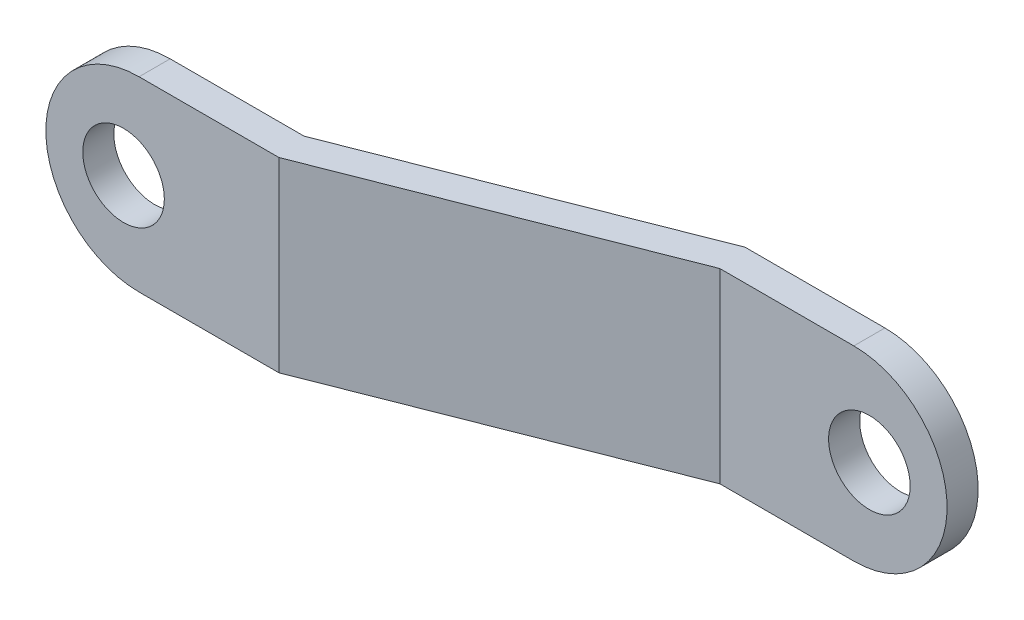
ISO-10303-21;
HEADER;
FILE_DESCRIPTION(('STEP AP214'),'2;1');
FILE_NAME('part.step','',(''),(''),'','','');
FILE_SCHEMA(('AUTOMOTIVE_DESIGN { 1 0 10303 214 1 1 1 1 }'));
ENDSEC;
DATA;
#1=APPLICATION_CONTEXT('core data for automotive mechanical design processes');
#2=APPLICATION_PROTOCOL_DEFINITION('international standard','automotive_design',2000,#1);
#3=PRODUCT_CONTEXT('',#1,'mechanical');
#4=PRODUCT('Part','Part','',(#3));
#5=PRODUCT_RELATED_PRODUCT_CATEGORY('part','',(#4));
#6=PRODUCT_DEFINITION_FORMATION('','',#4);
#7=PRODUCT_DEFINITION_CONTEXT('part definition',#1,'design');
#8=PRODUCT_DEFINITION('design','',#6,#7);
#9=PRODUCT_DEFINITION_SHAPE('','',#8);
#10=(LENGTH_UNIT() NAMED_UNIT(*) SI_UNIT(.MILLI.,.METRE.));
#11=(NAMED_UNIT(*) PLANE_ANGLE_UNIT() SI_UNIT($,.RADIAN.));
#12=(NAMED_UNIT(*) SI_UNIT($,.STERADIAN.) SOLID_ANGLE_UNIT());
#13=UNCERTAINTY_MEASURE_WITH_UNIT(LENGTH_MEASURE(1.E-05),#10,'distance_accuracy_value','');
#14=(GEOMETRIC_REPRESENTATION_CONTEXT(3) GLOBAL_UNCERTAINTY_ASSIGNED_CONTEXT((#13)) GLOBAL_UNIT_ASSIGNED_CONTEXT((#10,
#11,#12)) REPRESENTATION_CONTEXT('',''));
#15=CARTESIAN_POINT('',(0.,0.,0.));
#16=DIRECTION('',(0.,0.,1.));
#17=DIRECTION('',(1.,0.,0.));
#18=AXIS2_PLACEMENT_3D('',#15,#16,#17);
#19=CARTESIAN_POINT('',(-77.9706929487342,4.8,-7.76408510071878));
#20=DIRECTION('',(0.,0.,-1.));
#21=DIRECTION('',(-1.,0.,0.));
#22=AXIS2_PLACEMENT_3D('',#19,#20,#21);
#23=CYLINDRICAL_SURFACE('',#22,4.8);
#24=CARTESIAN_POINT('',(-77.9706929487342,4.8,-9.36408510071879));
#25=DIRECTION('',(0.,0.,-1.));
#26=DIRECTION('',(-1.,0.,0.));
#27=AXIS2_PLACEMENT_3D('',#24,#25,#26);
#28=CIRCLE('',#27,4.8);
#29=CARTESIAN_POINT('',(-77.9706929487342,9.6,-9.36408510071879));
#30=VERTEX_POINT('',#29);
#31=CARTESIAN_POINT('',(-77.9706929487342,0.,-9.36408510071879));
#32=VERTEX_POINT('',#31);
#33=EDGE_CURVE('E20',#30,#32,#28,.F.);
#34=ORIENTED_EDGE('',*,*,#33,.T.);
#35=DIRECTION('',(0.,0.,1.));
#36=VECTOR('',#35,1.);
#37=CARTESIAN_POINT('',(-77.9706929487342,0.,-7.76408510071878));
#38=LINE('',#37,#36);
#39=CARTESIAN_POINT('',(-77.9706929487342,0.,-7.76408510071878));
#40=VERTEX_POINT('',#39);
#41=EDGE_CURVE('E123',#32,#40,#38,.T.);
#42=ORIENTED_EDGE('',*,*,#41,.T.);
#43=CARTESIAN_POINT('',(-77.9706929487342,4.8,-7.76408510071878));
#44=DIRECTION('',(0.,0.,-1.));
#45=DIRECTION('',(-1.,0.,0.));
#46=AXIS2_PLACEMENT_3D('',#43,#44,#45);
#47=CIRCLE('',#46,4.8);
#48=CARTESIAN_POINT('',(-77.9706929487342,9.6,-7.76408510071878));
#49=VERTEX_POINT('',#48);
#50=EDGE_CURVE('E83',#40,#49,#47,.T.);
#51=ORIENTED_EDGE('',*,*,#50,.T.);
#52=DIRECTION('',(0.,0.,-1.));
#53=VECTOR('',#52,1.);
#54=CARTESIAN_POINT('',(-77.9706929487342,9.6,-7.76408510071878));
#55=LINE('',#54,#53);
#56=EDGE_CURVE('E79',#49,#30,#55,.T.);
#57=ORIENTED_EDGE('',*,*,#56,.T.);
#58=EDGE_LOOP('',(#34,#42,#51,#57));
#59=FACE_BOUND('',#58,.T.);
#60=ADVANCED_FACE('F17',(#59),#23,.T.);
#61=CARTESIAN_POINT('',(-78.7706929487342,4.8,-15.7640851007188));
#62=DIRECTION('',(0.,0.,1.));
#63=DIRECTION('',(1.,0.,0.));
#64=AXIS2_PLACEMENT_3D('',#61,#62,#63);
#65=CYLINDRICAL_SURFACE('',#64,2.1);
#66=CARTESIAN_POINT('',(-78.7706929487342,4.8,-9.36408510071879));
#67=DIRECTION('',(0.,0.,1.));
#68=DIRECTION('',(1.,0.,0.));
#69=AXIS2_PLACEMENT_3D('',#66,#67,#68);
#70=CIRCLE('',#69,2.1);
#71=CARTESIAN_POINT('',(-76.6706929487342,4.8,-9.36408510071879));
#72=VERTEX_POINT('',#71);
#73=EDGE_CURVE('E96',#72,#72,#70,.F.);
#74=ORIENTED_EDGE('',*,*,#73,.T.);
#75=EDGE_LOOP('',(#74));
#76=FACE_BOUND('',#75,.T.);
#77=CARTESIAN_POINT('',(-78.7706929487342,4.8,-7.76408510071878));
#78=DIRECTION('',(0.,0.,1.));
#79=DIRECTION('',(1.,0.,0.));
#80=AXIS2_PLACEMENT_3D('',#77,#78,#79);
#81=CIRCLE('',#80,2.1);
#82=CARTESIAN_POINT('',(-76.6706929487342,4.8,-7.76408510071878));
#83=VERTEX_POINT('',#82);
#84=EDGE_CURVE('E119',#83,#83,#81,.T.);
#85=ORIENTED_EDGE('',*,*,#84,.T.);
#86=EDGE_LOOP('',(#85));
#87=FACE_BOUND('',#86,.T.);
#88=ADVANCED_FACE('F150',(#76,#87),#65,.F.);
#89=CARTESIAN_POINT('',(-42.7706929487342,9.6,-15.7640851007188));
#90=DIRECTION('',(0.,0.,1.));
#91=DIRECTION('',(1.,0.,0.));
#92=AXIS2_PLACEMENT_3D('',#89,#90,#91);
#93=PLANE('',#92);
#94=CARTESIAN_POINT('',(-46.7706929487342,4.8,-15.7640851007188));
#95=DIRECTION('',(0.,0.,1.));
#96=DIRECTION('',(1.,0.,0.));
#97=AXIS2_PLACEMENT_3D('',#94,#95,#96);
#98=CIRCLE('',#97,2.1);
#99=CARTESIAN_POINT('',(-44.6706929487342,4.8,-15.7640851007188));
#100=VERTEX_POINT('',#99);
#101=EDGE_CURVE('E130',#100,#100,#98,.T.);
#102=ORIENTED_EDGE('',*,*,#101,.T.);
#103=EDGE_LOOP('',(#102));
#104=FACE_BOUND('',#103,.T.);
#105=DIRECTION('',(1.,0.,0.));
#106=VECTOR('',#105,1.);
#107=CARTESIAN_POINT('',(-82.7706929487342,0.,-15.7640851007188));
#108=LINE('',#107,#106);
#109=CARTESIAN_POINT('',(-47.5706929487342,0.,-15.7640851007188));
#110=VERTEX_POINT('',#109);
#111=CARTESIAN_POINT('',(-54.7706929487342,0.,-15.7640851007188));
#112=VERTEX_POINT('',#111);
#113=EDGE_CURVE('E126',#110,#112,#108,.F.);
#114=ORIENTED_EDGE('',*,*,#113,.T.);
#115=DIRECTION('',(0.,1.,0.));
#116=VECTOR('',#115,1.);
#117=CARTESIAN_POINT('',(-54.7706929487342,9.6,-15.7640851007188));
#118=LINE('',#117,#116);
#119=CARTESIAN_POINT('',(-54.7706929487342,9.6,-15.7640851007188));
#120=VERTEX_POINT('',#119);
#121=EDGE_CURVE('E87',#112,#120,#118,.T.);
#122=ORIENTED_EDGE('',*,*,#121,.T.);
#123=DIRECTION('',(1.,0.,0.));
#124=VECTOR('',#123,1.);
#125=CARTESIAN_POINT('',(-82.7706929487342,9.6,-15.7640851007188));
#126=LINE('',#125,#124);
#127=CARTESIAN_POINT('',(-47.5706929487342,9.6,-15.7640851007188));
#128=VERTEX_POINT('',#127);
#129=EDGE_CURVE('E106',#128,#120,#126,.F.);
#130=ORIENTED_EDGE('',*,*,#129,.F.);
#131=CARTESIAN_POINT('',(-47.5706929487342,4.8,-15.7640851007188));
#132=DIRECTION('',(0.,0.,-1.));
#133=DIRECTION('',(-1.,0.,0.));
#134=AXIS2_PLACEMENT_3D('',#131,#132,#133);
#135=CIRCLE('',#134,4.8);
#136=EDGE_CURVE('E146',#110,#128,#135,.F.);
#137=ORIENTED_EDGE('',*,*,#136,.F.);
#138=EDGE_LOOP('',(#114,#122,#130,#137));
#139=FACE_BOUND('',#138,.T.);
#140=ADVANCED_FACE('F165',(#104,#139),#93,.F.);
#141=CARTESIAN_POINT('',(-54.7706929487342,9.6,-15.7640851007188));
#142=DIRECTION('',(0.365421149026402,0.,0.930842298052803));
#143=DIRECTION('',(0.930842298052803,0.,-0.365421149026402));
#144=AXIS2_PLACEMENT_3D('',#141,#142,#143);
#145=PLANE('',#144);
#146=DIRECTION('',(-0.930842298052803,0.,0.365421149026402));
#147=VECTOR('',#146,1.);
#148=CARTESIAN_POINT('',(-54.7706929487342,9.6,-15.7640851007188));
#149=LINE('',#148,#147);
#150=CARTESIAN_POINT('',(-71.0735006089102,9.6,-9.36408510071879));
#151=VERTEX_POINT('',#150);
#152=EDGE_CURVE('E100',#120,#151,#149,.T.);
#153=ORIENTED_EDGE('',*,*,#152,.F.);
#154=ORIENTED_EDGE('',*,*,#121,.F.);
#155=DIRECTION('',(-0.930842298052803,0.,0.365421149026403));
#156=VECTOR('',#155,1.);
#157=CARTESIAN_POINT('',(-54.7706929487342,0.,-15.7640851007188));
#158=LINE('',#157,#156);
#159=CARTESIAN_POINT('',(-71.0735006089102,0.,-9.36408510071878));
#160=VERTEX_POINT('',#159);
#161=EDGE_CURVE('E129',#112,#160,#158,.T.);
#162=ORIENTED_EDGE('',*,*,#161,.T.);
#163=DIRECTION('',(0.,1.,0.));
#164=VECTOR('',#163,1.);
#165=CARTESIAN_POINT('',(-71.0735006089102,9.6,-9.36408510071879));
#166=LINE('',#165,#164);
#167=EDGE_CURVE('E97',#160,#151,#166,.T.);
#168=ORIENTED_EDGE('',*,*,#167,.T.);
#169=EDGE_LOOP('',(#153,#154,#162,#168));
#170=FACE_BOUND('',#169,.T.);
#171=ADVANCED_FACE('F155',(#170),#145,.F.);
#172=CARTESIAN_POINT('',(-71.0735006089102,9.6,-9.36408510071879));
#173=DIRECTION('',(0.,0.,1.));
#174=DIRECTION('',(1.,0.,0.));
#175=AXIS2_PLACEMENT_3D('',#172,#173,#174);
#176=PLANE('',#175);
#177=ORIENTED_EDGE('',*,*,#73,.F.);
#178=EDGE_LOOP('',(#177));
#179=FACE_BOUND('',#178,.T.);
#180=DIRECTION('',(1.,0.,0.));
#181=VECTOR('',#180,1.);
#182=CARTESIAN_POINT('',(-82.7706929487342,9.6,-9.36408510071879));
#183=LINE('',#182,#181);
#184=EDGE_CURVE('E93',#151,#30,#183,.F.);
#185=ORIENTED_EDGE('',*,*,#184,.F.);
#186=ORIENTED_EDGE('',*,*,#167,.F.);
#187=DIRECTION('',(1.,0.,0.));
#188=VECTOR('',#187,1.);
#189=CARTESIAN_POINT('',(-82.7706929487342,0.,-9.36408510071879));
#190=LINE('',#189,#188);
#191=EDGE_CURVE('E95',#160,#32,#190,.F.);
#192=ORIENTED_EDGE('',*,*,#191,.T.);
#193=ORIENTED_EDGE('',*,*,#33,.F.);
#194=EDGE_LOOP('',(#185,#186,#192,#193));
#195=FACE_BOUND('',#194,.T.);
#196=ADVANCED_FACE('F92',(#179,#195),#176,.F.);
#197=CARTESIAN_POINT('',(-47.5706929487342,4.8,-14.1640851007188));
#198=DIRECTION('',(0.,0.,-1.));
#199=DIRECTION('',(-1.,0.,0.));
#200=AXIS2_PLACEMENT_3D('',#197,#198,#199);
#201=CYLINDRICAL_SURFACE('',#200,4.8);
#202=DIRECTION('',(0.,0.,1.));
#203=VECTOR('',#202,1.);
#204=CARTESIAN_POINT('',(-47.5706929487342,9.6,-7.76408510071878));
#205=LINE('',#204,#203);
#206=CARTESIAN_POINT('',(-47.5706929487342,9.6,-14.1640851007188));
#207=VERTEX_POINT('',#206);
#208=EDGE_CURVE('E116',#207,#128,#205,.F.);
#209=ORIENTED_EDGE('',*,*,#208,.F.);
#210=CARTESIAN_POINT('',(-47.5706929487342,4.8,-14.1640851007188));
#211=DIRECTION('',(0.,0.,-1.));
#212=DIRECTION('',(-1.,0.,0.));
#213=AXIS2_PLACEMENT_3D('',#210,#211,#212);
#214=CIRCLE('',#213,4.8);
#215=CARTESIAN_POINT('',(-47.5706929487342,0.,-14.1640851007188));
#216=VERTEX_POINT('',#215);
#217=EDGE_CURVE('E137',#207,#216,#214,.T.);
#218=ORIENTED_EDGE('',*,*,#217,.T.);
#219=DIRECTION('',(0.,0.,1.));
#220=VECTOR('',#219,1.);
#221=CARTESIAN_POINT('',(-47.5706929487342,0.,-7.76408510071878));
#222=LINE('',#221,#220);
#223=EDGE_CURVE('E124',#216,#110,#222,.F.);
#224=ORIENTED_EDGE('',*,*,#223,.T.);
#225=ORIENTED_EDGE('',*,*,#136,.T.);
#226=EDGE_LOOP('',(#209,#218,#224,#225));
#227=FACE_BOUND('',#226,.T.);
#228=ADVANCED_FACE('F154',(#227),#201,.T.);
#229=CARTESIAN_POINT('',(-46.7706929487342,4.8,-15.7640851007188));
#230=DIRECTION('',(0.,0.,1.));
#231=DIRECTION('',(1.,0.,0.));
#232=AXIS2_PLACEMENT_3D('',#229,#230,#231);
#233=CYLINDRICAL_SURFACE('',#232,2.1);
#234=ORIENTED_EDGE('',*,*,#101,.F.);
#235=EDGE_LOOP('',(#234));
#236=FACE_BOUND('',#235,.T.);
#237=CARTESIAN_POINT('',(-46.7706929487342,4.8,-14.1640851007188));
#238=DIRECTION('',(0.,0.,1.));
#239=DIRECTION('',(1.,0.,0.));
#240=AXIS2_PLACEMENT_3D('',#237,#238,#239);
#241=CIRCLE('',#240,2.1);
#242=CARTESIAN_POINT('',(-44.6706929487342,4.8,-14.1640851007188));
#243=VERTEX_POINT('',#242);
#244=EDGE_CURVE('E134',#243,#243,#241,.T.);
#245=ORIENTED_EDGE('',*,*,#244,.T.);
#246=EDGE_LOOP('',(#245));
#247=FACE_BOUND('',#246,.T.);
#248=ADVANCED_FACE('F162',(#236,#247),#233,.F.);
#249=CARTESIAN_POINT('',(-82.7706929487342,0.,-7.76408510071878));
#250=DIRECTION('',(0.,1.,0.));
#251=DIRECTION('',(0.,0.,1.));
#252=AXIS2_PLACEMENT_3D('',#249,#250,#251);
#253=PLANE('',#252);
#254=DIRECTION('',(-1.,0.,0.));
#255=VECTOR('',#254,1.);
#256=CARTESIAN_POINT('',(-54.4678852885582,0.,-14.1640851007188));
#257=LINE('',#256,#255);
#258=CARTESIAN_POINT('',(-54.4678852885582,0.,-14.1640851007188));
#259=VERTEX_POINT('',#258);
#260=EDGE_CURVE('E102',#216,#259,#257,.T.);
#261=ORIENTED_EDGE('',*,*,#260,.T.);
#262=DIRECTION('',(-0.930842298052803,0.,0.365421149026402));
#263=VECTOR('',#262,1.);
#264=CARTESIAN_POINT('',(-70.7706929487342,0.,-7.76408510071878));
#265=LINE('',#264,#263);
#266=CARTESIAN_POINT('',(-70.7706929487342,0.,-7.76408510071879));
#267=VERTEX_POINT('',#266);
#268=EDGE_CURVE('E110',#259,#267,#265,.T.);
#269=ORIENTED_EDGE('',*,*,#268,.T.);
#270=DIRECTION('',(-1.,0.,0.));
#271=VECTOR('',#270,1.);
#272=CARTESIAN_POINT('',(-82.7706929487342,0.,-7.76408510071878));
#273=LINE('',#272,#271);
#274=EDGE_CURVE('E143',#267,#40,#273,.T.);
#275=ORIENTED_EDGE('',*,*,#274,.T.);
#276=ORIENTED_EDGE('',*,*,#41,.F.);
#277=ORIENTED_EDGE('',*,*,#191,.F.);
#278=ORIENTED_EDGE('',*,*,#161,.F.);
#279=ORIENTED_EDGE('',*,*,#113,.F.);
#280=ORIENTED_EDGE('',*,*,#223,.F.);
#281=EDGE_LOOP('',(#261,#269,#275,#276,#277,#278,#279,#280));
#282=FACE_BOUND('',#281,.T.);
#283=ADVANCED_FACE('F185',(#282),#253,.F.);
#284=CARTESIAN_POINT('',(-82.7706929487342,9.6,-7.76408510071878));
#285=DIRECTION('',(0.,0.,-1.));
#286=DIRECTION('',(-1.,0.,0.));
#287=AXIS2_PLACEMENT_3D('',#284,#285,#286);
#288=PLANE('',#287);
#289=ORIENTED_EDGE('',*,*,#84,.F.);
#290=EDGE_LOOP('',(#289));
#291=FACE_BOUND('',#290,.T.);
#292=ORIENTED_EDGE('',*,*,#274,.F.);
#293=DIRECTION('',(0.,1.,0.));
#294=VECTOR('',#293,1.);
#295=CARTESIAN_POINT('',(-70.7706929487342,9.6,-7.76408510071879));
#296=LINE('',#295,#294);
#297=CARTESIAN_POINT('',(-70.7706929487342,9.6,-7.76408510071879));
#298=VERTEX_POINT('',#297);
#299=EDGE_CURVE('E120',#267,#298,#296,.T.);
#300=ORIENTED_EDGE('',*,*,#299,.T.);
#301=DIRECTION('',(1.,0.,0.));
#302=VECTOR('',#301,1.);
#303=CARTESIAN_POINT('',(-82.7706929487342,9.6,-7.76408510071878));
#304=LINE('',#303,#302);
#305=EDGE_CURVE('E117',#49,#298,#304,.T.);
#306=ORIENTED_EDGE('',*,*,#305,.F.);
#307=ORIENTED_EDGE('',*,*,#50,.F.);
#308=EDGE_LOOP('',(#292,#300,#306,#307));
#309=FACE_BOUND('',#308,.T.);
#310=ADVANCED_FACE('F182',(#291,#309),#288,.F.);
#311=CARTESIAN_POINT('',(-82.7706929487342,9.6,-7.76408510071878));
#312=DIRECTION('',(0.,1.,0.));
#313=DIRECTION('',(0.,0.,1.));
#314=AXIS2_PLACEMENT_3D('',#311,#312,#313);
#315=PLANE('',#314);
#316=ORIENTED_EDGE('',*,*,#184,.T.);
#317=ORIENTED_EDGE('',*,*,#56,.F.);
#318=ORIENTED_EDGE('',*,*,#305,.T.);
#319=DIRECTION('',(-0.930842298052803,0.,0.365421149026402));
#320=VECTOR('',#319,1.);
#321=CARTESIAN_POINT('',(-70.7706929487342,9.6,-7.76408510071878));
#322=LINE('',#321,#320);
#323=CARTESIAN_POINT('',(-54.4678852885582,9.6,-14.1640851007188));
#324=VERTEX_POINT('',#323);
#325=EDGE_CURVE('E26',#298,#324,#322,.F.);
#326=ORIENTED_EDGE('',*,*,#325,.T.);
#327=DIRECTION('',(-1.,0.,0.));
#328=VECTOR('',#327,1.);
#329=CARTESIAN_POINT('',(-54.4678852885582,9.6,-14.1640851007188));
#330=LINE('',#329,#328);
#331=EDGE_CURVE('E34',#324,#207,#330,.F.);
#332=ORIENTED_EDGE('',*,*,#331,.T.);
#333=ORIENTED_EDGE('',*,*,#208,.T.);
#334=ORIENTED_EDGE('',*,*,#129,.T.);
#335=ORIENTED_EDGE('',*,*,#152,.T.);
#336=EDGE_LOOP('',(#316,#317,#318,#326,#332,#333,#334,#335));
#337=FACE_BOUND('',#336,.T.);
#338=ADVANCED_FACE('F98',(#337),#315,.T.);
#339=CARTESIAN_POINT('',(-54.4678852885582,9.6,-14.1640851007188));
#340=DIRECTION('',(0.,0.,-1.));
#341=DIRECTION('',(-1.,0.,0.));
#342=AXIS2_PLACEMENT_3D('',#339,#340,#341);
#343=PLANE('',#342);
#344=ORIENTED_EDGE('',*,*,#244,.F.);
#345=EDGE_LOOP('',(#344));
#346=FACE_BOUND('',#345,.T.);
#347=ORIENTED_EDGE('',*,*,#331,.F.);
#348=DIRECTION('',(0.,1.,0.));
#349=VECTOR('',#348,1.);
#350=CARTESIAN_POINT('',(-54.4678852885582,9.6,-14.1640851007188));
#351=LINE('',#350,#349);
#352=EDGE_CURVE('E10',#324,#259,#351,.F.);
#353=ORIENTED_EDGE('',*,*,#352,.T.);
#354=ORIENTED_EDGE('',*,*,#260,.F.);
#355=ORIENTED_EDGE('',*,*,#217,.F.);
#356=EDGE_LOOP('',(#347,#353,#354,#355));
#357=FACE_BOUND('',#356,.T.);
#358=ADVANCED_FACE('F170',(#346,#357),#343,.F.);
#359=CARTESIAN_POINT('',(-70.7706929487342,9.6,-7.76408510071878));
#360=DIRECTION('',(-0.365421149026402,0.,-0.930842298052803));
#361=DIRECTION('',(-0.930842298052803,0.,0.365421149026402));
#362=AXIS2_PLACEMENT_3D('',#359,#360,#361);
#363=PLANE('',#362);
#364=ORIENTED_EDGE('',*,*,#325,.F.);
#365=ORIENTED_EDGE('',*,*,#299,.F.);
#366=ORIENTED_EDGE('',*,*,#268,.F.);
#367=ORIENTED_EDGE('',*,*,#352,.F.);
#368=EDGE_LOOP('',(#364,#365,#366,#367));
#369=FACE_BOUND('',#368,.T.);
#370=ADVANCED_FACE('F168',(#369),#363,.F.);
#371=CLOSED_SHELL('',(#60,#88,#140,#171,#196,#228,#248,#283,#310,#338,#358,#370));
#372=MANIFOLD_SOLID_BREP('B1',#371);
#373=ADVANCED_BREP_SHAPE_REPRESENTATION('',(#18,#372),#14);
#374=SHAPE_DEFINITION_REPRESENTATION(#9,#373);
ENDSEC;
END-ISO-10303-21;
